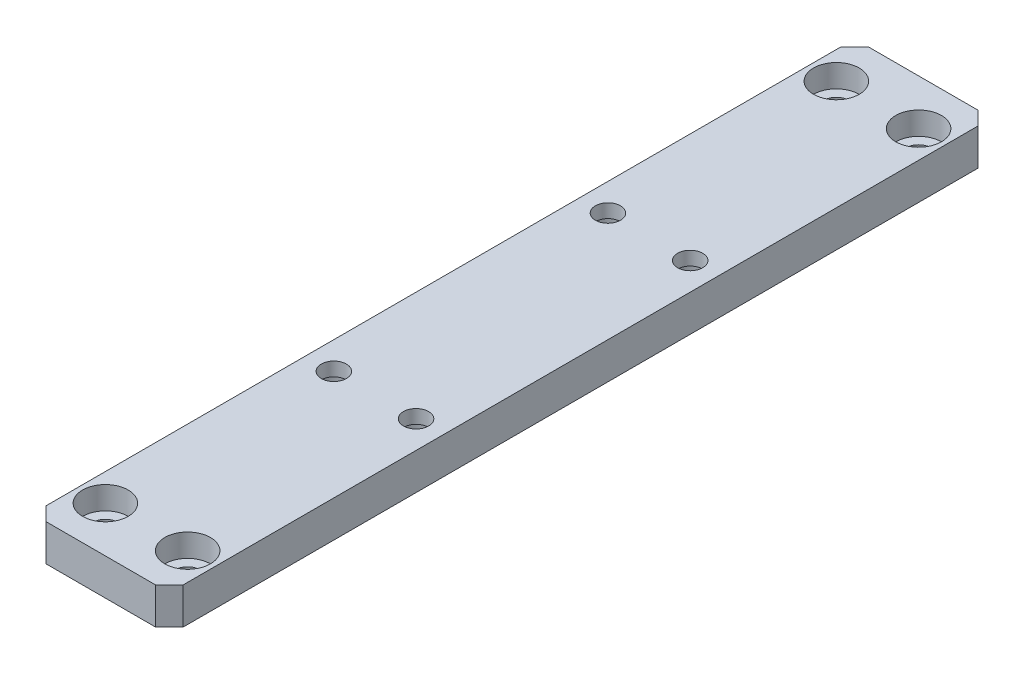
ISO-10303-21;
HEADER;
FILE_DESCRIPTION(('STEP AP214'),'2;1');
FILE_NAME('part.step','',(''),(''),'','','');
FILE_SCHEMA(('AUTOMOTIVE_DESIGN { 1 0 10303 214 1 1 1 1 }'));
ENDSEC;
DATA;
#1=APPLICATION_CONTEXT('core data for automotive mechanical design processes');
#2=APPLICATION_PROTOCOL_DEFINITION('international standard','automotive_design',2000,#1);
#3=PRODUCT_CONTEXT('',#1,'mechanical');
#4=PRODUCT('Part','Part','',(#3));
#5=PRODUCT_RELATED_PRODUCT_CATEGORY('part','',(#4));
#6=PRODUCT_DEFINITION_FORMATION('','',#4);
#7=PRODUCT_DEFINITION_CONTEXT('part definition',#1,'design');
#8=PRODUCT_DEFINITION('design','',#6,#7);
#9=PRODUCT_DEFINITION_SHAPE('','',#8);
#10=(LENGTH_UNIT() NAMED_UNIT(*) SI_UNIT(.MILLI.,.METRE.));
#11=(NAMED_UNIT(*) PLANE_ANGLE_UNIT() SI_UNIT($,.RADIAN.));
#12=(NAMED_UNIT(*) SI_UNIT($,.STERADIAN.) SOLID_ANGLE_UNIT());
#13=UNCERTAINTY_MEASURE_WITH_UNIT(LENGTH_MEASURE(1.E-05),#10,'distance_accuracy_value','');
#14=(GEOMETRIC_REPRESENTATION_CONTEXT(3) GLOBAL_UNCERTAINTY_ASSIGNED_CONTEXT((#13)) GLOBAL_UNIT_ASSIGNED_CONTEXT((#10,
#11,#12)) REPRESENTATION_CONTEXT('',''));
#15=CARTESIAN_POINT('',(0.,0.,0.));
#16=DIRECTION('',(0.,0.,1.));
#17=DIRECTION('',(1.,0.,0.));
#18=AXIS2_PLACEMENT_3D('',#15,#16,#17);
#19=CARTESIAN_POINT('',(30.,8.,-90.));
#20=DIRECTION('',(-1.,0.,0.));
#21=DIRECTION('',(0.,0.,1.));
#22=AXIS2_PLACEMENT_3D('',#19,#20,#21);
#23=PLANE('',#22);
#24=DIRECTION('',(0.,0.,-1.));
#25=VECTOR('',#24,1.);
#26=CARTESIAN_POINT('',(30.,0.,-90.));
#27=LINE('',#26,#25);
#28=CARTESIAN_POINT('',(30.,0.,87.));
#29=VERTEX_POINT('',#28);
#30=CARTESIAN_POINT('',(30.,0.,-87.));
#31=VERTEX_POINT('',#30);
#32=EDGE_CURVE('E156',#29,#31,#27,.T.);
#33=ORIENTED_EDGE('',*,*,#32,.T.);
#34=DIRECTION('',(0.,1.,0.));
#35=VECTOR('',#34,1.);
#36=CARTESIAN_POINT('',(30.,8.,-87.));
#37=LINE('',#36,#35);
#38=CARTESIAN_POINT('',(30.,8.,-87.));
#39=VERTEX_POINT('',#38);
#40=EDGE_CURVE('E11',#31,#39,#37,.T.);
#41=ORIENTED_EDGE('',*,*,#40,.T.);
#42=DIRECTION('',(0.,0.,-1.));
#43=VECTOR('',#42,1.);
#44=CARTESIAN_POINT('',(30.,8.,-90.));
#45=LINE('',#44,#43);
#46=CARTESIAN_POINT('',(30.,8.,87.));
#47=VERTEX_POINT('',#46);
#48=EDGE_CURVE('E124',#47,#39,#45,.T.);
#49=ORIENTED_EDGE('',*,*,#48,.F.);
#50=DIRECTION('',(0.,-1.,0.));
#51=VECTOR('',#50,1.);
#52=CARTESIAN_POINT('',(30.,8.,87.));
#53=LINE('',#52,#51);
#54=EDGE_CURVE('E40',#47,#29,#53,.T.);
#55=ORIENTED_EDGE('',*,*,#54,.T.);
#56=EDGE_LOOP('',(#33,#41,#49,#55));
#57=FACE_BOUND('',#56,.T.);
#58=ADVANCED_FACE('F32',(#57),#23,.F.);
#59=CARTESIAN_POINT('',(0.,8.,-90.));
#60=DIRECTION('',(0.,0.,1.));
#61=DIRECTION('',(1.,0.,0.));
#62=AXIS2_PLACEMENT_3D('',#59,#60,#61);
#63=PLANE('',#62);
#64=DIRECTION('',(-1.,0.,0.));
#65=VECTOR('',#64,1.);
#66=CARTESIAN_POINT('',(0.,0.,-90.));
#67=LINE('',#66,#65);
#68=CARTESIAN_POINT('',(27.,0.,-90.));
#69=VERTEX_POINT('',#68);
#70=CARTESIAN_POINT('',(3.00000000000001,0.,-90.));
#71=VERTEX_POINT('',#70);
#72=EDGE_CURVE('E129',#69,#71,#67,.T.);
#73=ORIENTED_EDGE('',*,*,#72,.T.);
#74=DIRECTION('',(0.,1.,0.));
#75=VECTOR('',#74,1.);
#76=CARTESIAN_POINT('',(3.00000000000001,8.,-90.));
#77=LINE('',#76,#75);
#78=CARTESIAN_POINT('',(3.,8.,-90.));
#79=VERTEX_POINT('',#78);
#80=EDGE_CURVE('E47',#71,#79,#77,.T.);
#81=ORIENTED_EDGE('',*,*,#80,.T.);
#82=DIRECTION('',(-1.,0.,0.));
#83=VECTOR('',#82,1.);
#84=CARTESIAN_POINT('',(0.,8.,-90.));
#85=LINE('',#84,#83);
#86=CARTESIAN_POINT('',(26.9999999999999,8.,-90.));
#87=VERTEX_POINT('',#86);
#88=EDGE_CURVE('E127',#87,#79,#85,.T.);
#89=ORIENTED_EDGE('',*,*,#88,.F.);
#90=DIRECTION('',(0.,-1.,0.));
#91=VECTOR('',#90,1.);
#92=CARTESIAN_POINT('',(27.,8.,-90.));
#93=LINE('',#92,#91);
#94=EDGE_CURVE('E148',#87,#69,#93,.T.);
#95=ORIENTED_EDGE('',*,*,#94,.T.);
#96=EDGE_LOOP('',(#73,#81,#89,#95));
#97=FACE_BOUND('',#96,.T.);
#98=ADVANCED_FACE('F314',(#97),#63,.F.);
#99=CARTESIAN_POINT('',(0.,8.,-90.));
#100=DIRECTION('',(1.,0.,0.));
#101=DIRECTION('',(0.,0.,-1.));
#102=AXIS2_PLACEMENT_3D('',#99,#100,#101);
#103=PLANE('',#102);
#104=DIRECTION('',(0.,0.,1.));
#105=VECTOR('',#104,1.);
#106=CARTESIAN_POINT('',(0.,0.,-90.));
#107=LINE('',#106,#105);
#108=CARTESIAN_POINT('',(0.,0.,-87.));
#109=VERTEX_POINT('',#108);
#110=CARTESIAN_POINT('',(0.,0.,86.9999999999999));
#111=VERTEX_POINT('',#110);
#112=EDGE_CURVE('E125',#109,#111,#107,.T.);
#113=ORIENTED_EDGE('',*,*,#112,.T.);
#114=DIRECTION('',(0.,1.,0.));
#115=VECTOR('',#114,1.);
#116=CARTESIAN_POINT('',(0.,8.,87.));
#117=LINE('',#116,#115);
#118=CARTESIAN_POINT('',(0.,8.,87.));
#119=VERTEX_POINT('',#118);
#120=EDGE_CURVE('E103',#111,#119,#117,.T.);
#121=ORIENTED_EDGE('',*,*,#120,.T.);
#122=DIRECTION('',(0.,0.,1.));
#123=VECTOR('',#122,1.);
#124=CARTESIAN_POINT('',(0.,8.,-90.));
#125=LINE('',#124,#123);
#126=CARTESIAN_POINT('',(0.,8.,-87.));
#127=VERTEX_POINT('',#126);
#128=EDGE_CURVE('E168',#127,#119,#125,.T.);
#129=ORIENTED_EDGE('',*,*,#128,.F.);
#130=DIRECTION('',(0.,-1.,0.));
#131=VECTOR('',#130,1.);
#132=CARTESIAN_POINT('',(0.,8.,-87.));
#133=LINE('',#132,#131);
#134=EDGE_CURVE('E108',#127,#109,#133,.T.);
#135=ORIENTED_EDGE('',*,*,#134,.T.);
#136=EDGE_LOOP('',(#113,#121,#129,#135));
#137=FACE_BOUND('',#136,.T.);
#138=ADVANCED_FACE('F311',(#137),#103,.F.);
#139=CARTESIAN_POINT('',(0.,8.,90.));
#140=DIRECTION('',(0.,0.,-1.));
#141=DIRECTION('',(-1.,0.,0.));
#142=AXIS2_PLACEMENT_3D('',#139,#140,#141);
#143=PLANE('',#142);
#144=DIRECTION('',(1.,0.,0.));
#145=VECTOR('',#144,1.);
#146=CARTESIAN_POINT('',(0.,8.,90.));
#147=LINE('',#146,#145);
#148=CARTESIAN_POINT('',(3.00000000000004,8.,90.));
#149=VERTEX_POINT('',#148);
#150=CARTESIAN_POINT('',(27.,8.,90.));
#151=VERTEX_POINT('',#150);
#152=EDGE_CURVE('E118',#149,#151,#147,.T.);
#153=ORIENTED_EDGE('',*,*,#152,.F.);
#154=DIRECTION('',(0.,-1.,0.));
#155=VECTOR('',#154,1.);
#156=CARTESIAN_POINT('',(3.00000000000004,8.,90.));
#157=LINE('',#156,#155);
#158=CARTESIAN_POINT('',(3.00000000000004,0.,90.));
#159=VERTEX_POINT('',#158);
#160=EDGE_CURVE('E102',#149,#159,#157,.T.);
#161=ORIENTED_EDGE('',*,*,#160,.T.);
#162=DIRECTION('',(1.,0.,0.));
#163=VECTOR('',#162,1.);
#164=CARTESIAN_POINT('',(0.,0.,90.));
#165=LINE('',#164,#163);
#166=CARTESIAN_POINT('',(27.,0.,90.));
#167=VERTEX_POINT('',#166);
#168=EDGE_CURVE('E115',#159,#167,#165,.T.);
#169=ORIENTED_EDGE('',*,*,#168,.T.);
#170=DIRECTION('',(0.,1.,0.));
#171=VECTOR('',#170,1.);
#172=CARTESIAN_POINT('',(27.,8.,90.));
#173=LINE('',#172,#171);
#174=EDGE_CURVE('E120',#167,#151,#173,.T.);
#175=ORIENTED_EDGE('',*,*,#174,.T.);
#176=EDGE_LOOP('',(#153,#161,#169,#175));
#177=FACE_BOUND('',#176,.T.);
#178=ADVANCED_FACE('F114',(#177),#143,.F.);
#179=CARTESIAN_POINT('',(30.,8.,90.));
#180=DIRECTION('',(0.,1.,0.));
#181=DIRECTION('',(0.,0.,1.));
#182=AXIS2_PLACEMENT_3D('',#179,#180,#181);
#183=PLANE('',#182);
#184=CARTESIAN_POINT('',(6.00000000000001,8.,30.));
#185=DIRECTION('',(0.,-1.,0.));
#186=DIRECTION('',(0.,0.,-1.));
#187=AXIS2_PLACEMENT_3D('',#184,#185,#186);
#188=CIRCLE('',#187,2.75);
#189=CARTESIAN_POINT('',(6.00000000000001,8.,27.25));
#190=VERTEX_POINT('',#189);
#191=EDGE_CURVE('E252',#190,#190,#188,.T.);
#192=ORIENTED_EDGE('',*,*,#191,.T.);
#193=EDGE_LOOP('',(#192));
#194=FACE_BOUND('',#193,.T.);
#195=CARTESIAN_POINT('',(6.00000000000001,8.,-30.));
#196=DIRECTION('',(0.,-1.,0.));
#197=DIRECTION('',(0.,0.,-1.));
#198=AXIS2_PLACEMENT_3D('',#195,#196,#197);
#199=CIRCLE('',#198,2.75);
#200=CARTESIAN_POINT('',(6.00000000000001,8.,-32.75));
#201=VERTEX_POINT('',#200);
#202=EDGE_CURVE('E240',#201,#201,#199,.T.);
#203=ORIENTED_EDGE('',*,*,#202,.T.);
#204=EDGE_LOOP('',(#203));
#205=FACE_BOUND('',#204,.T.);
#206=CARTESIAN_POINT('',(24.,8.,-30.));
#207=DIRECTION('',(0.,-1.,0.));
#208=DIRECTION('',(0.,0.,-1.));
#209=AXIS2_PLACEMENT_3D('',#206,#207,#208);
#210=CIRCLE('',#209,2.75);
#211=CARTESIAN_POINT('',(24.,8.,-32.75));
#212=VERTEX_POINT('',#211);
#213=EDGE_CURVE('E228',#212,#212,#210,.T.);
#214=ORIENTED_EDGE('',*,*,#213,.T.);
#215=EDGE_LOOP('',(#214));
#216=FACE_BOUND('',#215,.T.);
#217=CARTESIAN_POINT('',(24.,8.,30.));
#218=DIRECTION('',(0.,-1.,0.));
#219=DIRECTION('',(0.,0.,-1.));
#220=AXIS2_PLACEMENT_3D('',#217,#218,#219);
#221=CIRCLE('',#220,2.75);
#222=CARTESIAN_POINT('',(24.,8.,27.25));
#223=VERTEX_POINT('',#222);
#224=EDGE_CURVE('E216',#223,#223,#221,.T.);
#225=ORIENTED_EDGE('',*,*,#224,.T.);
#226=EDGE_LOOP('',(#225));
#227=FACE_BOUND('',#226,.T.);
#228=CARTESIAN_POINT('',(5.99999999999998,8.,-80.));
#229=DIRECTION('',(0.,1.,0.));
#230=DIRECTION('',(0.,0.,1.));
#231=AXIS2_PLACEMENT_3D('',#228,#229,#230);
#232=CIRCLE('',#231,5.);
#233=CARTESIAN_POINT('',(5.99999999999998,8.,-75.));
#234=VERTEX_POINT('',#233);
#235=EDGE_CURVE('E213',#234,#234,#232,.T.);
#236=ORIENTED_EDGE('',*,*,#235,.F.);
#237=EDGE_LOOP('',(#236));
#238=FACE_BOUND('',#237,.T.);
#239=CARTESIAN_POINT('',(6.00000000000001,8.,80.));
#240=DIRECTION('',(0.,1.,0.));
#241=DIRECTION('',(0.,0.,1.));
#242=AXIS2_PLACEMENT_3D('',#239,#240,#241);
#243=CIRCLE('',#242,5.);
#244=CARTESIAN_POINT('',(6.00000000000001,8.,85.));
#245=VERTEX_POINT('',#244);
#246=EDGE_CURVE('E201',#245,#245,#243,.T.);
#247=ORIENTED_EDGE('',*,*,#246,.F.);
#248=EDGE_LOOP('',(#247));
#249=FACE_BOUND('',#248,.T.);
#250=CARTESIAN_POINT('',(24.,8.,80.));
#251=DIRECTION('',(0.,1.,0.));
#252=DIRECTION('',(0.,0.,1.));
#253=AXIS2_PLACEMENT_3D('',#250,#251,#252);
#254=CIRCLE('',#253,5.);
#255=CARTESIAN_POINT('',(24.,8.,85.));
#256=VERTEX_POINT('',#255);
#257=EDGE_CURVE('E189',#256,#256,#254,.T.);
#258=ORIENTED_EDGE('',*,*,#257,.F.);
#259=EDGE_LOOP('',(#258));
#260=FACE_BOUND('',#259,.T.);
#261=CARTESIAN_POINT('',(24.,8.,-80.));
#262=DIRECTION('',(0.,1.,0.));
#263=DIRECTION('',(0.,0.,1.));
#264=AXIS2_PLACEMENT_3D('',#261,#262,#263);
#265=CIRCLE('',#264,5.);
#266=CARTESIAN_POINT('',(24.,8.,-75.));
#267=VERTEX_POINT('',#266);
#268=EDGE_CURVE('E177',#267,#267,#265,.T.);
#269=ORIENTED_EDGE('',*,*,#268,.F.);
#270=EDGE_LOOP('',(#269));
#271=FACE_BOUND('',#270,.T.);
#272=ORIENTED_EDGE('',*,*,#128,.T.);
#273=DIRECTION('',(-0.707106781186549,0.,-0.707106781186546));
#274=VECTOR('',#273,1.);
#275=CARTESIAN_POINT('',(16.5000000000001,8.,103.5));
#276=LINE('',#275,#274);
#277=EDGE_CURVE('E146',#119,#149,#276,.F.);
#278=ORIENTED_EDGE('',*,*,#277,.T.);
#279=ORIENTED_EDGE('',*,*,#152,.T.);
#280=DIRECTION('',(-0.707106781186551,0.,0.707106781186544));
#281=VECTOR('',#280,1.);
#282=CARTESIAN_POINT('',(28.5,8.,88.5));
#283=LINE('',#282,#281);
#284=EDGE_CURVE('E141',#151,#47,#283,.F.);
#285=ORIENTED_EDGE('',*,*,#284,.T.);
#286=ORIENTED_EDGE('',*,*,#48,.T.);
#287=DIRECTION('',(0.707106781186548,0.,0.707106781186548));
#288=VECTOR('',#287,1.);
#289=CARTESIAN_POINT('',(118.5,8.,1.50000000000002));
#290=LINE('',#289,#288);
#291=EDGE_CURVE('E54',#39,#87,#290,.F.);
#292=ORIENTED_EDGE('',*,*,#291,.T.);
#293=ORIENTED_EDGE('',*,*,#88,.T.);
#294=DIRECTION('',(0.707106781186551,0.,-0.707106781186544));
#295=VECTOR('',#294,1.);
#296=CARTESIAN_POINT('',(-73.4999999999999,8.,-13.5000000000008));
#297=LINE('',#296,#295);
#298=EDGE_CURVE('E144',#79,#127,#297,.F.);
#299=ORIENTED_EDGE('',*,*,#298,.T.);
#300=EDGE_LOOP('',(#272,#278,#279,#285,#286,#292,#293,#299));
#301=FACE_BOUND('',#300,.T.);
#302=ADVANCED_FACE('F269',(#194,#205,#216,#227,#238,#249,#260,#271,#301),#183,.T.);
#303=CARTESIAN_POINT('',(30.,0.,90.));
#304=DIRECTION('',(0.,1.,0.));
#305=DIRECTION('',(0.,0.,1.));
#306=AXIS2_PLACEMENT_3D('',#303,#304,#305);
#307=PLANE('',#306);
#308=CARTESIAN_POINT('',(6.00000000000001,0.,30.));
#309=DIRECTION('',(0.,-1.,0.));
#310=DIRECTION('',(0.,0.,-1.));
#311=AXIS2_PLACEMENT_3D('',#308,#309,#310);
#312=CIRCLE('',#311,4.99999999999999);
#313=CARTESIAN_POINT('',(6.00000000000001,0.,25.));
#314=VERTEX_POINT('',#313);
#315=EDGE_CURVE('E261',#314,#314,#312,.T.);
#316=ORIENTED_EDGE('',*,*,#315,.F.);
#317=EDGE_LOOP('',(#316));
#318=FACE_BOUND('',#317,.T.);
#319=CARTESIAN_POINT('',(6.00000000000001,0.,-30.));
#320=DIRECTION('',(0.,-1.,0.));
#321=DIRECTION('',(0.,0.,-1.));
#322=AXIS2_PLACEMENT_3D('',#319,#320,#321);
#323=CIRCLE('',#322,4.99999999999999);
#324=CARTESIAN_POINT('',(6.00000000000001,0.,-35.));
#325=VERTEX_POINT('',#324);
#326=EDGE_CURVE('E249',#325,#325,#323,.T.);
#327=ORIENTED_EDGE('',*,*,#326,.F.);
#328=EDGE_LOOP('',(#327));
#329=FACE_BOUND('',#328,.T.);
#330=CARTESIAN_POINT('',(24.,0.,-30.));
#331=DIRECTION('',(0.,-1.,0.));
#332=DIRECTION('',(0.,0.,-1.));
#333=AXIS2_PLACEMENT_3D('',#330,#331,#332);
#334=CIRCLE('',#333,4.99999999999999);
#335=CARTESIAN_POINT('',(24.,0.,-35.));
#336=VERTEX_POINT('',#335);
#337=EDGE_CURVE('E237',#336,#336,#334,.T.);
#338=ORIENTED_EDGE('',*,*,#337,.F.);
#339=EDGE_LOOP('',(#338));
#340=FACE_BOUND('',#339,.T.);
#341=CARTESIAN_POINT('',(24.,0.,30.));
#342=DIRECTION('',(0.,-1.,0.));
#343=DIRECTION('',(0.,0.,-1.));
#344=AXIS2_PLACEMENT_3D('',#341,#342,#343);
#345=CIRCLE('',#344,4.99999999999999);
#346=CARTESIAN_POINT('',(24.,0.,25.));
#347=VERTEX_POINT('',#346);
#348=EDGE_CURVE('E225',#347,#347,#345,.T.);
#349=ORIENTED_EDGE('',*,*,#348,.F.);
#350=EDGE_LOOP('',(#349));
#351=FACE_BOUND('',#350,.T.);
#352=CARTESIAN_POINT('',(5.99999999999998,0.,-80.));
#353=DIRECTION('',(0.,1.,0.));
#354=DIRECTION('',(0.,0.,1.));
#355=AXIS2_PLACEMENT_3D('',#352,#353,#354);
#356=CIRCLE('',#355,2.75);
#357=CARTESIAN_POINT('',(5.99999999999998,0.,-77.25));
#358=VERTEX_POINT('',#357);
#359=EDGE_CURVE('E204',#358,#358,#356,.T.);
#360=ORIENTED_EDGE('',*,*,#359,.T.);
#361=EDGE_LOOP('',(#360));
#362=FACE_BOUND('',#361,.T.);
#363=CARTESIAN_POINT('',(6.00000000000001,0.,80.));
#364=DIRECTION('',(0.,1.,0.));
#365=DIRECTION('',(0.,0.,1.));
#366=AXIS2_PLACEMENT_3D('',#363,#364,#365);
#367=CIRCLE('',#366,2.75);
#368=CARTESIAN_POINT('',(6.00000000000001,0.,82.75));
#369=VERTEX_POINT('',#368);
#370=EDGE_CURVE('E192',#369,#369,#367,.T.);
#371=ORIENTED_EDGE('',*,*,#370,.T.);
#372=EDGE_LOOP('',(#371));
#373=FACE_BOUND('',#372,.T.);
#374=CARTESIAN_POINT('',(24.,0.,80.));
#375=DIRECTION('',(0.,1.,0.));
#376=DIRECTION('',(0.,0.,1.));
#377=AXIS2_PLACEMENT_3D('',#374,#375,#376);
#378=CIRCLE('',#377,2.75);
#379=CARTESIAN_POINT('',(24.,0.,82.75));
#380=VERTEX_POINT('',#379);
#381=EDGE_CURVE('E180',#380,#380,#378,.T.);
#382=ORIENTED_EDGE('',*,*,#381,.T.);
#383=EDGE_LOOP('',(#382));
#384=FACE_BOUND('',#383,.T.);
#385=CARTESIAN_POINT('',(24.,0.,-80.));
#386=DIRECTION('',(0.,1.,0.));
#387=DIRECTION('',(0.,0.,1.));
#388=AXIS2_PLACEMENT_3D('',#385,#386,#387);
#389=CIRCLE('',#388,2.75);
#390=CARTESIAN_POINT('',(24.,0.,-77.25));
#391=VERTEX_POINT('',#390);
#392=EDGE_CURVE('E161',#391,#391,#389,.T.);
#393=ORIENTED_EDGE('',*,*,#392,.T.);
#394=EDGE_LOOP('',(#393));
#395=FACE_BOUND('',#394,.T.);
#396=ORIENTED_EDGE('',*,*,#168,.F.);
#397=DIRECTION('',(0.707106781186549,0.,0.707106781186546));
#398=VECTOR('',#397,1.);
#399=CARTESIAN_POINT('',(3.00000000000004,0.,90.));
#400=LINE('',#399,#398);
#401=EDGE_CURVE('E98',#159,#111,#400,.F.);
#402=ORIENTED_EDGE('',*,*,#401,.T.);
#403=ORIENTED_EDGE('',*,*,#112,.F.);
#404=DIRECTION('',(-0.707106781186551,0.,0.707106781186544));
#405=VECTOR('',#404,1.);
#406=CARTESIAN_POINT('',(0.,0.,-87.));
#407=LINE('',#406,#405);
#408=EDGE_CURVE('E109',#109,#71,#407,.F.);
#409=ORIENTED_EDGE('',*,*,#408,.T.);
#410=ORIENTED_EDGE('',*,*,#72,.F.);
#411=DIRECTION('',(-0.707106781186548,0.,-0.707106781186548));
#412=VECTOR('',#411,1.);
#413=CARTESIAN_POINT('',(27.,0.,-90.));
#414=LINE('',#413,#412);
#415=EDGE_CURVE('E135',#69,#31,#414,.F.);
#416=ORIENTED_EDGE('',*,*,#415,.T.);
#417=ORIENTED_EDGE('',*,*,#32,.F.);
#418=DIRECTION('',(0.707106781186551,0.,-0.707106781186544));
#419=VECTOR('',#418,1.);
#420=CARTESIAN_POINT('',(30.,0.,87.));
#421=LINE('',#420,#419);
#422=EDGE_CURVE('E119',#29,#167,#421,.F.);
#423=ORIENTED_EDGE('',*,*,#422,.T.);
#424=EDGE_LOOP('',(#396,#402,#403,#409,#410,#416,#417,#423));
#425=FACE_BOUND('',#424,.T.);
#426=ADVANCED_FACE('F122',(#318,#329,#340,#351,#362,#373,#384,#395,#425),#307,.F.);
#427=CARTESIAN_POINT('',(3.00000000000004,8.,90.));
#428=DIRECTION('',(0.707106781186546,0.,-0.707106781186549));
#429=DIRECTION('',(-0.707106781186549,0.,-0.707106781186546));
#430=AXIS2_PLACEMENT_3D('',#427,#428,#429);
#431=PLANE('',#430);
#432=ORIENTED_EDGE('',*,*,#277,.F.);
#433=ORIENTED_EDGE('',*,*,#120,.F.);
#434=ORIENTED_EDGE('',*,*,#401,.F.);
#435=ORIENTED_EDGE('',*,*,#160,.F.);
#436=EDGE_LOOP('',(#432,#433,#434,#435));
#437=FACE_BOUND('',#436,.T.);
#438=ADVANCED_FACE('F101',(#437),#431,.F.);
#439=CARTESIAN_POINT('',(0.,8.,-87.));
#440=DIRECTION('',(0.707106781186544,0.,0.707106781186551));
#441=DIRECTION('',(0.707106781186551,0.,-0.707106781186544));
#442=AXIS2_PLACEMENT_3D('',#439,#440,#441);
#443=PLANE('',#442);
#444=ORIENTED_EDGE('',*,*,#298,.F.);
#445=ORIENTED_EDGE('',*,*,#80,.F.);
#446=ORIENTED_EDGE('',*,*,#408,.F.);
#447=ORIENTED_EDGE('',*,*,#134,.F.);
#448=EDGE_LOOP('',(#444,#445,#446,#447));
#449=FACE_BOUND('',#448,.T.);
#450=ADVANCED_FACE('F313',(#449),#443,.F.);
#451=CARTESIAN_POINT('',(27.,8.,-90.));
#452=DIRECTION('',(-0.707106781186547,0.,0.707106781186547));
#453=DIRECTION('',(0.707106781186548,0.,0.707106781186548));
#454=AXIS2_PLACEMENT_3D('',#451,#452,#453);
#455=PLANE('',#454);
#456=ORIENTED_EDGE('',*,*,#291,.F.);
#457=ORIENTED_EDGE('',*,*,#40,.F.);
#458=ORIENTED_EDGE('',*,*,#415,.F.);
#459=ORIENTED_EDGE('',*,*,#94,.F.);
#460=EDGE_LOOP('',(#456,#457,#458,#459));
#461=FACE_BOUND('',#460,.T.);
#462=ADVANCED_FACE('F317',(#461),#455,.F.);
#463=CARTESIAN_POINT('',(30.,8.,87.));
#464=DIRECTION('',(-0.707106781186544,0.,-0.707106781186551));
#465=DIRECTION('',(-0.707106781186551,0.,0.707106781186544));
#466=AXIS2_PLACEMENT_3D('',#463,#464,#465);
#467=PLANE('',#466);
#468=ORIENTED_EDGE('',*,*,#284,.F.);
#469=ORIENTED_EDGE('',*,*,#174,.F.);
#470=ORIENTED_EDGE('',*,*,#422,.F.);
#471=ORIENTED_EDGE('',*,*,#54,.F.);
#472=EDGE_LOOP('',(#468,#469,#470,#471));
#473=FACE_BOUND('',#472,.T.);
#474=ADVANCED_FACE('F34',(#473),#467,.F.);
#475=CARTESIAN_POINT('',(24.,8.,-80.));
#476=DIRECTION('',(0.,1.,0.));
#477=DIRECTION('',(0.,0.,1.));
#478=AXIS2_PLACEMENT_3D('',#475,#476,#477);
#479=CYLINDRICAL_SURFACE('',#478,2.75);
#480=ORIENTED_EDGE('',*,*,#392,.F.);
#481=EDGE_LOOP('',(#480));
#482=FACE_BOUND('',#481,.T.);
#483=CARTESIAN_POINT('',(24.,3.,-80.));
#484=DIRECTION('',(0.,1.,0.));
#485=DIRECTION('',(0.,0.,1.));
#486=AXIS2_PLACEMENT_3D('',#483,#484,#485);
#487=CIRCLE('',#486,2.75);
#488=CARTESIAN_POINT('',(24.,3.,-77.25));
#489=VERTEX_POINT('',#488);
#490=EDGE_CURVE('E164',#489,#489,#487,.T.);
#491=ORIENTED_EDGE('',*,*,#490,.T.);
#492=EDGE_LOOP('',(#491));
#493=FACE_BOUND('',#492,.T.);
#494=ADVANCED_FACE('F285',(#482,#493),#479,.F.);
#495=CARTESIAN_POINT('',(26.75,3.,-80.));
#496=DIRECTION('',(0.,-1.,0.));
#497=DIRECTION('',(0.,0.,-1.));
#498=AXIS2_PLACEMENT_3D('',#495,#496,#497);
#499=PLANE('',#498);
#500=ORIENTED_EDGE('',*,*,#490,.F.);
#501=EDGE_LOOP('',(#500));
#502=FACE_BOUND('',#501,.T.);
#503=CARTESIAN_POINT('',(24.,3.,-80.));
#504=DIRECTION('',(0.,1.,0.));
#505=DIRECTION('',(0.,0.,1.));
#506=AXIS2_PLACEMENT_3D('',#503,#504,#505);
#507=CIRCLE('',#506,5.);
#508=CARTESIAN_POINT('',(24.,3.,-75.));
#509=VERTEX_POINT('',#508);
#510=EDGE_CURVE('E174',#509,#509,#507,.T.);
#511=ORIENTED_EDGE('',*,*,#510,.T.);
#512=EDGE_LOOP('',(#511));
#513=FACE_BOUND('',#512,.T.);
#514=ADVANCED_FACE('F288',(#502,#513),#499,.F.);
#515=CARTESIAN_POINT('',(24.,8.,-80.));
#516=DIRECTION('',(0.,1.,0.));
#517=DIRECTION('',(0.,0.,1.));
#518=AXIS2_PLACEMENT_3D('',#515,#516,#517);
#519=CYLINDRICAL_SURFACE('',#518,5.);
#520=ORIENTED_EDGE('',*,*,#510,.F.);
#521=EDGE_LOOP('',(#520));
#522=FACE_BOUND('',#521,.T.);
#523=ORIENTED_EDGE('',*,*,#268,.T.);
#524=EDGE_LOOP('',(#523));
#525=FACE_BOUND('',#524,.T.);
#526=ADVANCED_FACE('F294',(#522,#525),#519,.F.);
#527=CARTESIAN_POINT('',(24.,8.,80.));
#528=DIRECTION('',(0.,1.,0.));
#529=DIRECTION('',(0.,0.,1.));
#530=AXIS2_PLACEMENT_3D('',#527,#528,#529);
#531=CYLINDRICAL_SURFACE('',#530,2.75);
#532=ORIENTED_EDGE('',*,*,#381,.F.);
#533=EDGE_LOOP('',(#532));
#534=FACE_BOUND('',#533,.T.);
#535=CARTESIAN_POINT('',(24.,3.,80.));
#536=DIRECTION('',(0.,1.,0.));
#537=DIRECTION('',(0.,0.,1.));
#538=AXIS2_PLACEMENT_3D('',#535,#536,#537);
#539=CIRCLE('',#538,2.75);
#540=CARTESIAN_POINT('',(24.,3.,82.75));
#541=VERTEX_POINT('',#540);
#542=EDGE_CURVE('E183',#541,#541,#539,.T.);
#543=ORIENTED_EDGE('',*,*,#542,.T.);
#544=EDGE_LOOP('',(#543));
#545=FACE_BOUND('',#544,.T.);
#546=ADVANCED_FACE('F300',(#534,#545),#531,.F.);
#547=CARTESIAN_POINT('',(26.75,3.,80.));
#548=DIRECTION('',(0.,-1.,0.));
#549=DIRECTION('',(0.,0.,-1.));
#550=AXIS2_PLACEMENT_3D('',#547,#548,#549);
#551=PLANE('',#550);
#552=ORIENTED_EDGE('',*,*,#542,.F.);
#553=EDGE_LOOP('',(#552));
#554=FACE_BOUND('',#553,.T.);
#555=CARTESIAN_POINT('',(24.,3.,80.));
#556=DIRECTION('',(0.,1.,0.));
#557=DIRECTION('',(0.,0.,1.));
#558=AXIS2_PLACEMENT_3D('',#555,#556,#557);
#559=CIRCLE('',#558,5.);
#560=CARTESIAN_POINT('',(24.,3.,85.));
#561=VERTEX_POINT('',#560);
#562=EDGE_CURVE('E186',#561,#561,#559,.T.);
#563=ORIENTED_EDGE('',*,*,#562,.T.);
#564=EDGE_LOOP('',(#563));
#565=FACE_BOUND('',#564,.T.);
#566=ADVANCED_FACE('F372',(#554,#565),#551,.F.);
#567=CARTESIAN_POINT('',(24.,8.,80.));
#568=DIRECTION('',(0.,1.,0.));
#569=DIRECTION('',(0.,0.,1.));
#570=AXIS2_PLACEMENT_3D('',#567,#568,#569);
#571=CYLINDRICAL_SURFACE('',#570,5.);
#572=ORIENTED_EDGE('',*,*,#562,.F.);
#573=EDGE_LOOP('',(#572));
#574=FACE_BOUND('',#573,.T.);
#575=ORIENTED_EDGE('',*,*,#257,.T.);
#576=EDGE_LOOP('',(#575));
#577=FACE_BOUND('',#576,.T.);
#578=ADVANCED_FACE('F382',(#574,#577),#571,.F.);
#579=CARTESIAN_POINT('',(6.00000000000001,8.,80.));
#580=DIRECTION('',(0.,1.,0.));
#581=DIRECTION('',(0.,0.,1.));
#582=AXIS2_PLACEMENT_3D('',#579,#580,#581);
#583=CYLINDRICAL_SURFACE('',#582,2.75);
#584=ORIENTED_EDGE('',*,*,#370,.F.);
#585=EDGE_LOOP('',(#584));
#586=FACE_BOUND('',#585,.T.);
#587=CARTESIAN_POINT('',(6.00000000000001,3.,80.));
#588=DIRECTION('',(0.,1.,0.));
#589=DIRECTION('',(0.,0.,1.));
#590=AXIS2_PLACEMENT_3D('',#587,#588,#589);
#591=CIRCLE('',#590,2.75);
#592=CARTESIAN_POINT('',(6.00000000000001,3.,82.75));
#593=VERTEX_POINT('',#592);
#594=EDGE_CURVE('E195',#593,#593,#591,.T.);
#595=ORIENTED_EDGE('',*,*,#594,.T.);
#596=EDGE_LOOP('',(#595));
#597=FACE_BOUND('',#596,.T.);
#598=ADVANCED_FACE('F392',(#586,#597),#583,.F.);
#599=CARTESIAN_POINT('',(8.75,3.,80.));
#600=DIRECTION('',(0.,-1.,0.));
#601=DIRECTION('',(0.,0.,-1.));
#602=AXIS2_PLACEMENT_3D('',#599,#600,#601);
#603=PLANE('',#602);
#604=ORIENTED_EDGE('',*,*,#594,.F.);
#605=EDGE_LOOP('',(#604));
#606=FACE_BOUND('',#605,.T.);
#607=CARTESIAN_POINT('',(6.00000000000001,3.,80.));
#608=DIRECTION('',(0.,1.,0.));
#609=DIRECTION('',(0.,0.,1.));
#610=AXIS2_PLACEMENT_3D('',#607,#608,#609);
#611=CIRCLE('',#610,5.);
#612=CARTESIAN_POINT('',(6.00000000000001,3.,85.));
#613=VERTEX_POINT('',#612);
#614=EDGE_CURVE('E198',#613,#613,#611,.T.);
#615=ORIENTED_EDGE('',*,*,#614,.T.);
#616=EDGE_LOOP('',(#615));
#617=FACE_BOUND('',#616,.T.);
#618=ADVANCED_FACE('F402',(#606,#617),#603,.F.);
#619=CARTESIAN_POINT('',(6.00000000000001,8.,80.));
#620=DIRECTION('',(0.,1.,0.));
#621=DIRECTION('',(0.,0.,1.));
#622=AXIS2_PLACEMENT_3D('',#619,#620,#621);
#623=CYLINDRICAL_SURFACE('',#622,5.);
#624=ORIENTED_EDGE('',*,*,#614,.F.);
#625=EDGE_LOOP('',(#624));
#626=FACE_BOUND('',#625,.T.);
#627=ORIENTED_EDGE('',*,*,#246,.T.);
#628=EDGE_LOOP('',(#627));
#629=FACE_BOUND('',#628,.T.);
#630=ADVANCED_FACE('F412',(#626,#629),#623,.F.);
#631=CARTESIAN_POINT('',(5.99999999999998,8.,-80.));
#632=DIRECTION('',(0.,1.,0.));
#633=DIRECTION('',(0.,0.,1.));
#634=AXIS2_PLACEMENT_3D('',#631,#632,#633);
#635=CYLINDRICAL_SURFACE('',#634,2.75);
#636=ORIENTED_EDGE('',*,*,#359,.F.);
#637=EDGE_LOOP('',(#636));
#638=FACE_BOUND('',#637,.T.);
#639=CARTESIAN_POINT('',(5.99999999999998,3.,-80.));
#640=DIRECTION('',(0.,1.,0.));
#641=DIRECTION('',(0.,0.,1.));
#642=AXIS2_PLACEMENT_3D('',#639,#640,#641);
#643=CIRCLE('',#642,2.75);
#644=CARTESIAN_POINT('',(5.99999999999998,3.,-77.25));
#645=VERTEX_POINT('',#644);
#646=EDGE_CURVE('E207',#645,#645,#643,.T.);
#647=ORIENTED_EDGE('',*,*,#646,.T.);
#648=EDGE_LOOP('',(#647));
#649=FACE_BOUND('',#648,.T.);
#650=ADVANCED_FACE('F422',(#638,#649),#635,.F.);
#651=CARTESIAN_POINT('',(8.74999999999998,3.,-80.));
#652=DIRECTION('',(0.,-1.,0.));
#653=DIRECTION('',(0.,0.,-1.));
#654=AXIS2_PLACEMENT_3D('',#651,#652,#653);
#655=PLANE('',#654);
#656=ORIENTED_EDGE('',*,*,#646,.F.);
#657=EDGE_LOOP('',(#656));
#658=FACE_BOUND('',#657,.T.);
#659=CARTESIAN_POINT('',(5.99999999999998,3.,-80.));
#660=DIRECTION('',(0.,1.,0.));
#661=DIRECTION('',(0.,0.,1.));
#662=AXIS2_PLACEMENT_3D('',#659,#660,#661);
#663=CIRCLE('',#662,5.);
#664=CARTESIAN_POINT('',(5.99999999999998,3.,-75.));
#665=VERTEX_POINT('',#664);
#666=EDGE_CURVE('E210',#665,#665,#663,.T.);
#667=ORIENTED_EDGE('',*,*,#666,.T.);
#668=EDGE_LOOP('',(#667));
#669=FACE_BOUND('',#668,.T.);
#670=ADVANCED_FACE('F432',(#658,#669),#655,.F.);
#671=CARTESIAN_POINT('',(5.99999999999998,8.,-80.));
#672=DIRECTION('',(0.,1.,0.));
#673=DIRECTION('',(0.,0.,1.));
#674=AXIS2_PLACEMENT_3D('',#671,#672,#673);
#675=CYLINDRICAL_SURFACE('',#674,5.);
#676=ORIENTED_EDGE('',*,*,#666,.F.);
#677=EDGE_LOOP('',(#676));
#678=FACE_BOUND('',#677,.T.);
#679=ORIENTED_EDGE('',*,*,#235,.T.);
#680=EDGE_LOOP('',(#679));
#681=FACE_BOUND('',#680,.T.);
#682=ADVANCED_FACE('F442',(#678,#681),#675,.F.);
#683=CARTESIAN_POINT('',(24.,0.,30.));
#684=DIRECTION('',(0.,-1.,0.));
#685=DIRECTION('',(0.,0.,-1.));
#686=AXIS2_PLACEMENT_3D('',#683,#684,#685);
#687=CYLINDRICAL_SURFACE('',#686,2.75);
#688=ORIENTED_EDGE('',*,*,#224,.F.);
#689=EDGE_LOOP('',(#688));
#690=FACE_BOUND('',#689,.T.);
#691=CARTESIAN_POINT('',(24.,5.,30.));
#692=DIRECTION('',(0.,-1.,0.));
#693=DIRECTION('',(0.,0.,-1.));
#694=AXIS2_PLACEMENT_3D('',#691,#692,#693);
#695=CIRCLE('',#694,2.75000000000001);
#696=CARTESIAN_POINT('',(24.,5.,27.25));
#697=VERTEX_POINT('',#696);
#698=EDGE_CURVE('E219',#697,#697,#695,.T.);
#699=ORIENTED_EDGE('',*,*,#698,.T.);
#700=EDGE_LOOP('',(#699));
#701=FACE_BOUND('',#700,.T.);
#702=ADVANCED_FACE('F452',(#690,#701),#687,.F.);
#703=CARTESIAN_POINT('',(26.75,5.,30.));
#704=DIRECTION('',(0.,1.,0.));
#705=DIRECTION('',(0.,0.,1.));
#706=AXIS2_PLACEMENT_3D('',#703,#704,#705);
#707=PLANE('',#706);
#708=ORIENTED_EDGE('',*,*,#698,.F.);
#709=EDGE_LOOP('',(#708));
#710=FACE_BOUND('',#709,.T.);
#711=CARTESIAN_POINT('',(24.,5.,30.));
#712=DIRECTION('',(0.,-1.,0.));
#713=DIRECTION('',(0.,0.,-1.));
#714=AXIS2_PLACEMENT_3D('',#711,#712,#713);
#715=CIRCLE('',#714,4.99999999999999);
#716=CARTESIAN_POINT('',(24.,5.,25.));
#717=VERTEX_POINT('',#716);
#718=EDGE_CURVE('E222',#717,#717,#715,.T.);
#719=ORIENTED_EDGE('',*,*,#718,.T.);
#720=EDGE_LOOP('',(#719));
#721=FACE_BOUND('',#720,.T.);
#722=ADVANCED_FACE('F477',(#710,#721),#707,.F.);
#723=CARTESIAN_POINT('',(24.,0.,30.));
#724=DIRECTION('',(0.,-1.,0.));
#725=DIRECTION('',(0.,0.,-1.));
#726=AXIS2_PLACEMENT_3D('',#723,#724,#725);
#727=CYLINDRICAL_SURFACE('',#726,4.99999999999999);
#728=ORIENTED_EDGE('',*,*,#718,.F.);
#729=EDGE_LOOP('',(#728));
#730=FACE_BOUND('',#729,.T.);
#731=ORIENTED_EDGE('',*,*,#348,.T.);
#732=EDGE_LOOP('',(#731));
#733=FACE_BOUND('',#732,.T.);
#734=ADVANCED_FACE('F487',(#730,#733),#727,.F.);
#735=CARTESIAN_POINT('',(24.,0.,-30.));
#736=DIRECTION('',(0.,-1.,0.));
#737=DIRECTION('',(0.,0.,-1.));
#738=AXIS2_PLACEMENT_3D('',#735,#736,#737);
#739=CYLINDRICAL_SURFACE('',#738,2.75);
#740=ORIENTED_EDGE('',*,*,#213,.F.);
#741=EDGE_LOOP('',(#740));
#742=FACE_BOUND('',#741,.T.);
#743=CARTESIAN_POINT('',(24.,5.,-30.));
#744=DIRECTION('',(0.,-1.,0.));
#745=DIRECTION('',(0.,0.,-1.));
#746=AXIS2_PLACEMENT_3D('',#743,#744,#745);
#747=CIRCLE('',#746,2.75000000000001);
#748=CARTESIAN_POINT('',(24.,5.,-32.75));
#749=VERTEX_POINT('',#748);
#750=EDGE_CURVE('E231',#749,#749,#747,.T.);
#751=ORIENTED_EDGE('',*,*,#750,.T.);
#752=EDGE_LOOP('',(#751));
#753=FACE_BOUND('',#752,.T.);
#754=ADVANCED_FACE('F497',(#742,#753),#739,.F.);
#755=CARTESIAN_POINT('',(26.75,5.,-30.));
#756=DIRECTION('',(0.,1.,0.));
#757=DIRECTION('',(0.,0.,1.));
#758=AXIS2_PLACEMENT_3D('',#755,#756,#757);
#759=PLANE('',#758);
#760=ORIENTED_EDGE('',*,*,#750,.F.);
#761=EDGE_LOOP('',(#760));
#762=FACE_BOUND('',#761,.T.);
#763=CARTESIAN_POINT('',(24.,5.,-30.));
#764=DIRECTION('',(0.,-1.,0.));
#765=DIRECTION('',(0.,0.,-1.));
#766=AXIS2_PLACEMENT_3D('',#763,#764,#765);
#767=CIRCLE('',#766,4.99999999999999);
#768=CARTESIAN_POINT('',(24.,5.,-35.));
#769=VERTEX_POINT('',#768);
#770=EDGE_CURVE('E234',#769,#769,#767,.T.);
#771=ORIENTED_EDGE('',*,*,#770,.T.);
#772=EDGE_LOOP('',(#771));
#773=FACE_BOUND('',#772,.T.);
#774=ADVANCED_FACE('F507',(#762,#773),#759,.F.);
#775=CARTESIAN_POINT('',(24.,0.,-30.));
#776=DIRECTION('',(0.,-1.,0.));
#777=DIRECTION('',(0.,0.,-1.));
#778=AXIS2_PLACEMENT_3D('',#775,#776,#777);
#779=CYLINDRICAL_SURFACE('',#778,4.99999999999999);
#780=ORIENTED_EDGE('',*,*,#770,.F.);
#781=EDGE_LOOP('',(#780));
#782=FACE_BOUND('',#781,.T.);
#783=ORIENTED_EDGE('',*,*,#337,.T.);
#784=EDGE_LOOP('',(#783));
#785=FACE_BOUND('',#784,.T.);
#786=ADVANCED_FACE('F517',(#782,#785),#779,.F.);
#787=CARTESIAN_POINT('',(6.00000000000001,0.,-30.));
#788=DIRECTION('',(0.,-1.,0.));
#789=DIRECTION('',(0.,0.,-1.));
#790=AXIS2_PLACEMENT_3D('',#787,#788,#789);
#791=CYLINDRICAL_SURFACE('',#790,2.75);
#792=ORIENTED_EDGE('',*,*,#202,.F.);
#793=EDGE_LOOP('',(#792));
#794=FACE_BOUND('',#793,.T.);
#795=CARTESIAN_POINT('',(6.00000000000001,5.,-30.));
#796=DIRECTION('',(0.,-1.,0.));
#797=DIRECTION('',(0.,0.,-1.));
#798=AXIS2_PLACEMENT_3D('',#795,#796,#797);
#799=CIRCLE('',#798,2.75000000000001);
#800=CARTESIAN_POINT('',(6.00000000000001,5.,-32.75));
#801=VERTEX_POINT('',#800);
#802=EDGE_CURVE('E243',#801,#801,#799,.T.);
#803=ORIENTED_EDGE('',*,*,#802,.T.);
#804=EDGE_LOOP('',(#803));
#805=FACE_BOUND('',#804,.T.);
#806=ADVANCED_FACE('F527',(#794,#805),#791,.F.);
#807=CARTESIAN_POINT('',(8.75000000000001,5.,-30.));
#808=DIRECTION('',(0.,1.,0.));
#809=DIRECTION('',(0.,0.,1.));
#810=AXIS2_PLACEMENT_3D('',#807,#808,#809);
#811=PLANE('',#810);
#812=ORIENTED_EDGE('',*,*,#802,.F.);
#813=EDGE_LOOP('',(#812));
#814=FACE_BOUND('',#813,.T.);
#815=CARTESIAN_POINT('',(6.00000000000001,5.,-30.));
#816=DIRECTION('',(0.,-1.,0.));
#817=DIRECTION('',(0.,0.,-1.));
#818=AXIS2_PLACEMENT_3D('',#815,#816,#817);
#819=CIRCLE('',#818,4.99999999999999);
#820=CARTESIAN_POINT('',(6.00000000000001,5.,-35.));
#821=VERTEX_POINT('',#820);
#822=EDGE_CURVE('E246',#821,#821,#819,.T.);
#823=ORIENTED_EDGE('',*,*,#822,.T.);
#824=EDGE_LOOP('',(#823));
#825=FACE_BOUND('',#824,.T.);
#826=ADVANCED_FACE('F537',(#814,#825),#811,.F.);
#827=CARTESIAN_POINT('',(6.00000000000001,0.,-30.));
#828=DIRECTION('',(0.,-1.,0.));
#829=DIRECTION('',(0.,0.,-1.));
#830=AXIS2_PLACEMENT_3D('',#827,#828,#829);
#831=CYLINDRICAL_SURFACE('',#830,4.99999999999999);
#832=ORIENTED_EDGE('',*,*,#822,.F.);
#833=EDGE_LOOP('',(#832));
#834=FACE_BOUND('',#833,.T.);
#835=ORIENTED_EDGE('',*,*,#326,.T.);
#836=EDGE_LOOP('',(#835));
#837=FACE_BOUND('',#836,.T.);
#838=ADVANCED_FACE('F547',(#834,#837),#831,.F.);
#839=CARTESIAN_POINT('',(6.00000000000001,0.,30.));
#840=DIRECTION('',(0.,-1.,0.));
#841=DIRECTION('',(0.,0.,-1.));
#842=AXIS2_PLACEMENT_3D('',#839,#840,#841);
#843=CYLINDRICAL_SURFACE('',#842,2.75);
#844=ORIENTED_EDGE('',*,*,#191,.F.);
#845=EDGE_LOOP('',(#844));
#846=FACE_BOUND('',#845,.T.);
#847=CARTESIAN_POINT('',(6.00000000000001,5.,30.));
#848=DIRECTION('',(0.,-1.,0.));
#849=DIRECTION('',(0.,0.,-1.));
#850=AXIS2_PLACEMENT_3D('',#847,#848,#849);
#851=CIRCLE('',#850,2.75000000000001);
#852=CARTESIAN_POINT('',(6.00000000000001,5.,27.25));
#853=VERTEX_POINT('',#852);
#854=EDGE_CURVE('E255',#853,#853,#851,.T.);
#855=ORIENTED_EDGE('',*,*,#854,.T.);
#856=EDGE_LOOP('',(#855));
#857=FACE_BOUND('',#856,.T.);
#858=ADVANCED_FACE('F557',(#846,#857),#843,.F.);
#859=CARTESIAN_POINT('',(8.75000000000001,5.,30.));
#860=DIRECTION('',(0.,1.,0.));
#861=DIRECTION('',(0.,0.,1.));
#862=AXIS2_PLACEMENT_3D('',#859,#860,#861);
#863=PLANE('',#862);
#864=ORIENTED_EDGE('',*,*,#854,.F.);
#865=EDGE_LOOP('',(#864));
#866=FACE_BOUND('',#865,.T.);
#867=CARTESIAN_POINT('',(6.00000000000001,5.,30.));
#868=DIRECTION('',(0.,-1.,0.));
#869=DIRECTION('',(0.,0.,-1.));
#870=AXIS2_PLACEMENT_3D('',#867,#868,#869);
#871=CIRCLE('',#870,4.99999999999999);
#872=CARTESIAN_POINT('',(6.00000000000001,5.,25.));
#873=VERTEX_POINT('',#872);
#874=EDGE_CURVE('E258',#873,#873,#871,.T.);
#875=ORIENTED_EDGE('',*,*,#874,.T.);
#876=EDGE_LOOP('',(#875));
#877=FACE_BOUND('',#876,.T.);
#878=ADVANCED_FACE('F567',(#866,#877),#863,.F.);
#879=CARTESIAN_POINT('',(6.00000000000001,0.,30.));
#880=DIRECTION('',(0.,-1.,0.));
#881=DIRECTION('',(0.,0.,-1.));
#882=AXIS2_PLACEMENT_3D('',#879,#880,#881);
#883=CYLINDRICAL_SURFACE('',#882,4.99999999999999);
#884=ORIENTED_EDGE('',*,*,#874,.F.);
#885=EDGE_LOOP('',(#884));
#886=FACE_BOUND('',#885,.T.);
#887=ORIENTED_EDGE('',*,*,#315,.T.);
#888=EDGE_LOOP('',(#887));
#889=FACE_BOUND('',#888,.T.);
#890=ADVANCED_FACE('F265',(#886,#889),#883,.F.);
#891=CLOSED_SHELL('',(#58,#98,#138,#178,#302,#426,#438,#450,#462,#474,#494,#514,#526,#546,#566,
#578,#598,#618,#630,#650,#670,#682,#702,#722,#734,#754,#774,#786,#806,#826,#838,#858,#878,#890));
#892=MANIFOLD_SOLID_BREP('B2',#891);
#893=ADVANCED_BREP_SHAPE_REPRESENTATION('',(#18,#892),#14);
#894=SHAPE_DEFINITION_REPRESENTATION(#9,#893);
ENDSEC;
END-ISO-10303-21;
